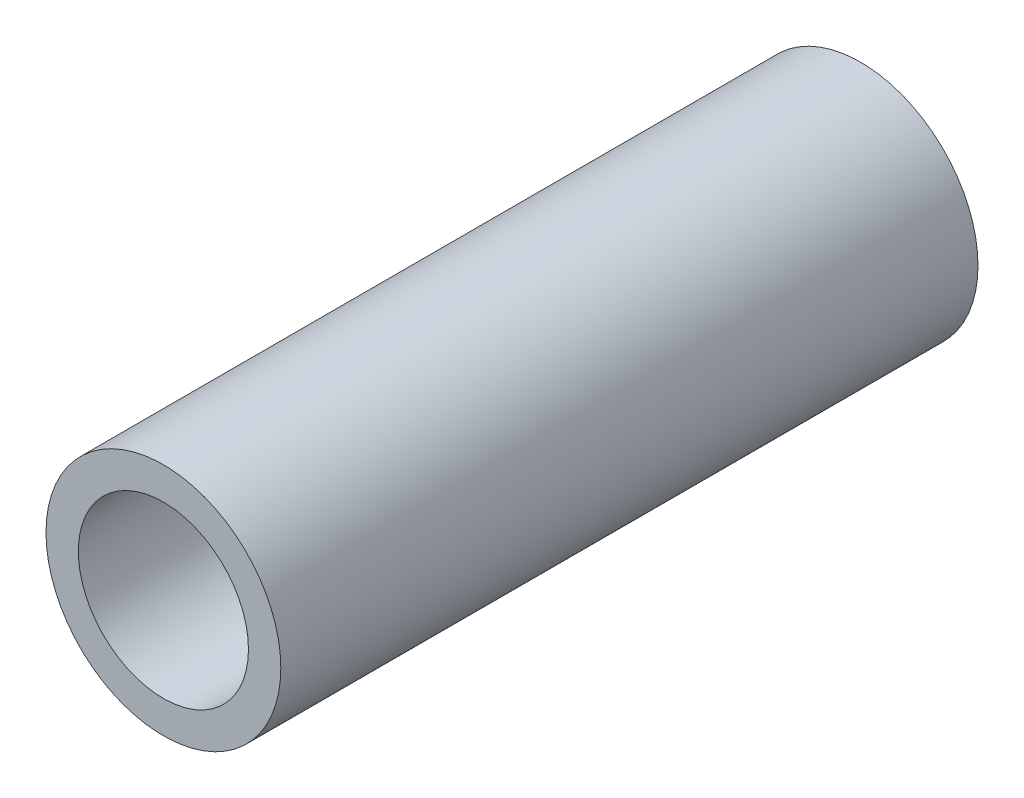
ISO-10303-21;
HEADER;
FILE_DESCRIPTION(('STEP AP214'),'2;1');
FILE_NAME('part.step','',(''),(''),'','','');
FILE_SCHEMA(('AUTOMOTIVE_DESIGN { 1 0 10303 214 1 1 1 1 }'));
ENDSEC;
DATA;
#1=APPLICATION_CONTEXT('core data for automotive mechanical design processes');
#2=APPLICATION_PROTOCOL_DEFINITION('international standard','automotive_design',2000,#1);
#3=PRODUCT_CONTEXT('',#1,'mechanical');
#4=PRODUCT('Part','Part','',(#3));
#5=PRODUCT_RELATED_PRODUCT_CATEGORY('part','',(#4));
#6=PRODUCT_DEFINITION_FORMATION('','',#4);
#7=PRODUCT_DEFINITION_CONTEXT('part definition',#1,'design');
#8=PRODUCT_DEFINITION('design','',#6,#7);
#9=PRODUCT_DEFINITION_SHAPE('','',#8);
#10=(LENGTH_UNIT() NAMED_UNIT(*) SI_UNIT(.MILLI.,.METRE.));
#11=(NAMED_UNIT(*) PLANE_ANGLE_UNIT() SI_UNIT($,.RADIAN.));
#12=(NAMED_UNIT(*) SI_UNIT($,.STERADIAN.) SOLID_ANGLE_UNIT());
#13=UNCERTAINTY_MEASURE_WITH_UNIT(LENGTH_MEASURE(1.E-05),#10,'distance_accuracy_value','');
#14=(GEOMETRIC_REPRESENTATION_CONTEXT(3) GLOBAL_UNCERTAINTY_ASSIGNED_CONTEXT((#13)) GLOBAL_UNIT_ASSIGNED_CONTEXT((#10,
#11,#12)) REPRESENTATION_CONTEXT('',''));
#15=CARTESIAN_POINT('',(0.,0.,0.));
#16=DIRECTION('',(0.,0.,1.));
#17=DIRECTION('',(1.,0.,0.));
#18=AXIS2_PLACEMENT_3D('',#15,#16,#17);
#19=CARTESIAN_POINT('',(0.,0.,63.5));
#20=DIRECTION('',(0.,0.,1.));
#21=DIRECTION('',(1.,0.,0.));
#22=AXIS2_PLACEMENT_3D('',#19,#20,#21);
#23=PLANE('',#22);
#24=CARTESIAN_POINT('',(0.,0.,63.5));
#25=DIRECTION('',(0.,0.,1.));
#26=DIRECTION('',(1.,0.,0.));
#27=AXIS2_PLACEMENT_3D('',#24,#25,#26);
#28=CIRCLE('',#27,10.6934);
#29=CARTESIAN_POINT('',(10.6934,0.,63.5));
#30=VERTEX_POINT('',#29);
#31=EDGE_CURVE('E10',#30,#30,#28,.T.);
#32=ORIENTED_EDGE('',*,*,#31,.T.);
#33=EDGE_LOOP('',(#32));
#34=FACE_BOUND('',#33,.T.);
#35=CARTESIAN_POINT('',(0.,0.,63.5));
#36=DIRECTION('',(0.,0.,1.));
#37=DIRECTION('',(1.,0.,0.));
#38=AXIS2_PLACEMENT_3D('',#35,#36,#37);
#39=CIRCLE('',#38,7.747);
#40=CARTESIAN_POINT('',(7.747,0.,63.5));
#41=VERTEX_POINT('',#40);
#42=EDGE_CURVE('E46',#41,#41,#39,.T.);
#43=ORIENTED_EDGE('',*,*,#42,.F.);
#44=EDGE_LOOP('',(#43));
#45=FACE_BOUND('',#44,.T.);
#46=ADVANCED_FACE('F35',(#34,#45),#23,.T.);
#47=CARTESIAN_POINT('',(0.,0.,0.));
#48=DIRECTION('',(0.,0.,1.));
#49=DIRECTION('',(1.,0.,0.));
#50=AXIS2_PLACEMENT_3D('',#47,#48,#49);
#51=PLANE('',#50);
#52=CARTESIAN_POINT('',(0.,0.,0.));
#53=DIRECTION('',(0.,0.,1.));
#54=DIRECTION('',(1.,0.,0.));
#55=AXIS2_PLACEMENT_3D('',#52,#53,#54);
#56=CIRCLE('',#55,10.6934);
#57=CARTESIAN_POINT('',(10.6934,0.,0.));
#58=VERTEX_POINT('',#57);
#59=EDGE_CURVE('E39',#58,#58,#56,.T.);
#60=ORIENTED_EDGE('',*,*,#59,.F.);
#61=EDGE_LOOP('',(#60));
#62=FACE_BOUND('',#61,.T.);
#63=CARTESIAN_POINT('',(0.,0.,0.));
#64=DIRECTION('',(0.,0.,1.));
#65=DIRECTION('',(1.,0.,0.));
#66=AXIS2_PLACEMENT_3D('',#63,#64,#65);
#67=CIRCLE('',#66,7.747);
#68=CARTESIAN_POINT('',(7.747,0.,0.));
#69=VERTEX_POINT('',#68);
#70=EDGE_CURVE('E48',#69,#69,#67,.T.);
#71=ORIENTED_EDGE('',*,*,#70,.T.);
#72=EDGE_LOOP('',(#71));
#73=FACE_BOUND('',#72,.T.);
#74=ADVANCED_FACE('F58',(#62,#73),#51,.F.);
#75=CARTESIAN_POINT('',(0.,0.,63.5));
#76=DIRECTION('',(0.,0.,-1.));
#77=DIRECTION('',(-1.,0.,0.));
#78=AXIS2_PLACEMENT_3D('',#75,#76,#77);
#79=CYLINDRICAL_SURFACE('',#78,10.6934);
#80=ORIENTED_EDGE('',*,*,#31,.F.);
#81=EDGE_LOOP('',(#80));
#82=FACE_BOUND('',#81,.T.);
#83=ORIENTED_EDGE('',*,*,#59,.T.);
#84=EDGE_LOOP('',(#83));
#85=FACE_BOUND('',#84,.T.);
#86=ADVANCED_FACE('F37',(#82,#85),#79,.T.);
#87=CARTESIAN_POINT('',(0.,0.,63.5));
#88=DIRECTION('',(0.,0.,-1.));
#89=DIRECTION('',(-1.,0.,0.));
#90=AXIS2_PLACEMENT_3D('',#87,#88,#89);
#91=CYLINDRICAL_SURFACE('',#90,7.747);
#92=ORIENTED_EDGE('',*,*,#42,.T.);
#93=EDGE_LOOP('',(#92));
#94=FACE_BOUND('',#93,.T.);
#95=ORIENTED_EDGE('',*,*,#70,.F.);
#96=EDGE_LOOP('',(#95));
#97=FACE_BOUND('',#96,.T.);
#98=ADVANCED_FACE('F54',(#94,#97),#91,.F.);
#99=CLOSED_SHELL('',(#46,#74,#86,#98));
#100=MANIFOLD_SOLID_BREP('B2',#99);
#101=ADVANCED_BREP_SHAPE_REPRESENTATION('',(#18,#100),#14);
#102=SHAPE_DEFINITION_REPRESENTATION(#9,#101);
ENDSEC;
END-ISO-10303-21;
